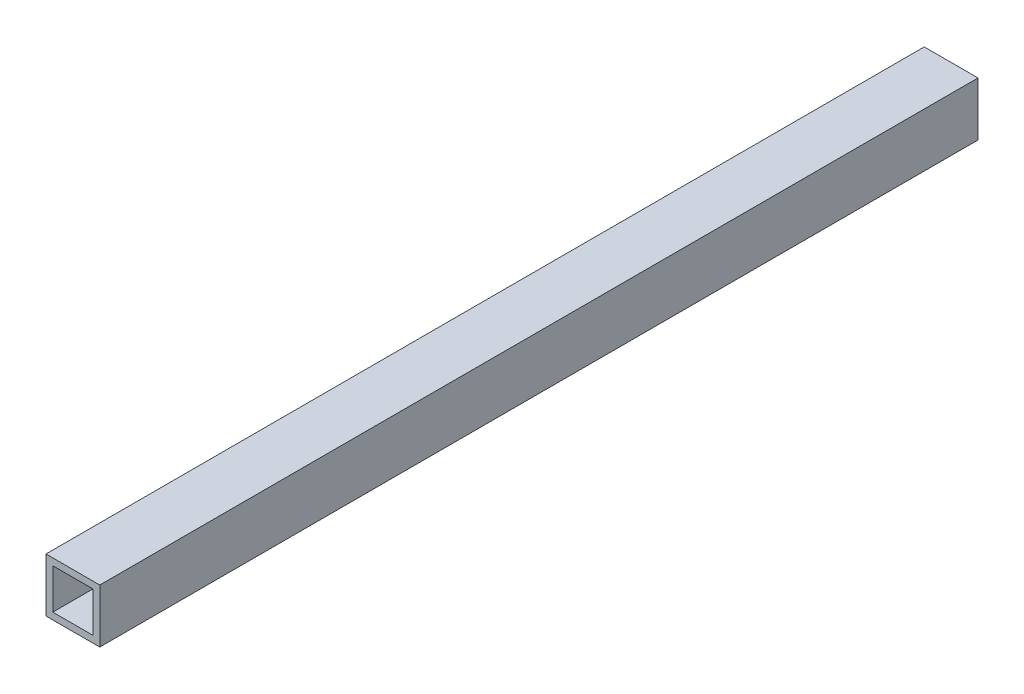
ISO-10303-21;
HEADER;
FILE_DESCRIPTION(('STEP AP214'),'2;1');
FILE_NAME('part.step','',(''),(''),'','','');
FILE_SCHEMA(('AUTOMOTIVE_DESIGN { 1 0 10303 214 1 1 1 1 }'));
ENDSEC;
DATA;
#1=APPLICATION_CONTEXT('core data for automotive mechanical design processes');
#2=APPLICATION_PROTOCOL_DEFINITION('international standard','automotive_design',2000,#1);
#3=PRODUCT_CONTEXT('',#1,'mechanical');
#4=PRODUCT('Part','Part','',(#3));
#5=PRODUCT_RELATED_PRODUCT_CATEGORY('part','',(#4));
#6=PRODUCT_DEFINITION_FORMATION('','',#4);
#7=PRODUCT_DEFINITION_CONTEXT('part definition',#1,'design');
#8=PRODUCT_DEFINITION('design','',#6,#7);
#9=PRODUCT_DEFINITION_SHAPE('','',#8);
#10=(LENGTH_UNIT() NAMED_UNIT(*) SI_UNIT(.MILLI.,.METRE.));
#11=(NAMED_UNIT(*) PLANE_ANGLE_UNIT() SI_UNIT($,.RADIAN.));
#12=(NAMED_UNIT(*) SI_UNIT($,.STERADIAN.) SOLID_ANGLE_UNIT());
#13=UNCERTAINTY_MEASURE_WITH_UNIT(LENGTH_MEASURE(1.E-05),#10,'distance_accuracy_value','');
#14=(GEOMETRIC_REPRESENTATION_CONTEXT(3) GLOBAL_UNCERTAINTY_ASSIGNED_CONTEXT((#13)) GLOBAL_UNIT_ASSIGNED_CONTEXT((#10,
#11,#12)) REPRESENTATION_CONTEXT('',''));
#15=CARTESIAN_POINT('',(0.,0.,0.));
#16=DIRECTION('',(0.,0.,1.));
#17=DIRECTION('',(1.,0.,0.));
#18=AXIS2_PLACEMENT_3D('',#15,#16,#17);
#19=CARTESIAN_POINT('',(0.,0.,99.));
#20=DIRECTION('',(0.,0.,1.));
#21=DIRECTION('',(1.,0.,0.));
#22=AXIS2_PLACEMENT_3D('',#19,#20,#21);
#23=PLANE('',#22);
#24=DIRECTION('',(0.,1.,0.));
#25=VECTOR('',#24,1.);
#26=CARTESIAN_POINT('',(6.06,6.06,99.));
#27=LINE('',#26,#25);
#28=CARTESIAN_POINT('',(6.06,-6.06,99.));
#29=VERTEX_POINT('',#28);
#30=CARTESIAN_POINT('',(6.06,6.06,99.));
#31=VERTEX_POINT('',#30);
#32=EDGE_CURVE('E134',#29,#31,#27,.T.);
#33=ORIENTED_EDGE('',*,*,#32,.T.);
#34=DIRECTION('',(-1.,0.,0.));
#35=VECTOR('',#34,1.);
#36=CARTESIAN_POINT('',(-6.06,6.06,99.));
#37=LINE('',#36,#35);
#38=CARTESIAN_POINT('',(-6.06,6.06,99.));
#39=VERTEX_POINT('',#38);
#40=EDGE_CURVE('E137',#31,#39,#37,.T.);
#41=ORIENTED_EDGE('',*,*,#40,.T.);
#42=DIRECTION('',(0.,-1.,0.));
#43=VECTOR('',#42,1.);
#44=CARTESIAN_POINT('',(-6.06,6.06,99.));
#45=LINE('',#44,#43);
#46=CARTESIAN_POINT('',(-6.06,-6.06,99.));
#47=VERTEX_POINT('',#46);
#48=EDGE_CURVE('E140',#39,#47,#45,.T.);
#49=ORIENTED_EDGE('',*,*,#48,.T.);
#50=DIRECTION('',(1.,0.,0.));
#51=VECTOR('',#50,1.);
#52=CARTESIAN_POINT('',(-6.06,-6.06,99.));
#53=LINE('',#52,#51);
#54=EDGE_CURVE('E142',#47,#29,#53,.T.);
#55=ORIENTED_EDGE('',*,*,#54,.T.);
#56=EDGE_LOOP('',(#33,#41,#49,#55));
#57=FACE_BOUND('',#56,.T.);
#58=DIRECTION('',(-1.,0.,0.));
#59=VECTOR('',#58,1.);
#60=CARTESIAN_POINT('',(-4.53,4.53,99.));
#61=LINE('',#60,#59);
#62=CARTESIAN_POINT('',(4.53,4.53,99.));
#63=VERTEX_POINT('',#62);
#64=CARTESIAN_POINT('',(-4.53,4.53,99.));
#65=VERTEX_POINT('',#64);
#66=EDGE_CURVE('E106',#63,#65,#61,.T.);
#67=ORIENTED_EDGE('',*,*,#66,.F.);
#68=DIRECTION('',(0.,1.,0.));
#69=VECTOR('',#68,1.);
#70=CARTESIAN_POINT('',(4.53,4.53,99.));
#71=LINE('',#70,#69);
#72=CARTESIAN_POINT('',(4.53,-4.53,99.));
#73=VERTEX_POINT('',#72);
#74=EDGE_CURVE('E98',#73,#63,#71,.T.);
#75=ORIENTED_EDGE('',*,*,#74,.F.);
#76=DIRECTION('',(1.,0.,0.));
#77=VECTOR('',#76,1.);
#78=CARTESIAN_POINT('',(-4.53,-4.53,99.));
#79=LINE('',#78,#77);
#80=CARTESIAN_POINT('',(-4.53,-4.53,99.));
#81=VERTEX_POINT('',#80);
#82=EDGE_CURVE('E120',#81,#73,#79,.T.);
#83=ORIENTED_EDGE('',*,*,#82,.F.);
#84=DIRECTION('',(0.,-1.,0.));
#85=VECTOR('',#84,1.);
#86=CARTESIAN_POINT('',(-4.53,4.53,99.));
#87=LINE('',#86,#85);
#88=EDGE_CURVE('E118',#65,#81,#87,.T.);
#89=ORIENTED_EDGE('',*,*,#88,.F.);
#90=EDGE_LOOP('',(#67,#75,#83,#89));
#91=FACE_BOUND('',#90,.T.);
#92=ADVANCED_FACE('F33',(#57,#91),#23,.T.);
#93=CARTESIAN_POINT('',(0.,0.,-99.));
#94=DIRECTION('',(0.,0.,1.));
#95=DIRECTION('',(1.,0.,0.));
#96=AXIS2_PLACEMENT_3D('',#93,#94,#95);
#97=PLANE('',#96);
#98=DIRECTION('',(0.,1.,0.));
#99=VECTOR('',#98,1.);
#100=CARTESIAN_POINT('',(6.06,6.06,-99.));
#101=LINE('',#100,#99);
#102=CARTESIAN_POINT('',(6.06,-6.06,-99.));
#103=VERTEX_POINT('',#102);
#104=CARTESIAN_POINT('',(6.06,6.06,-99.));
#105=VERTEX_POINT('',#104);
#106=EDGE_CURVE('E114',#103,#105,#101,.T.);
#107=ORIENTED_EDGE('',*,*,#106,.F.);
#108=DIRECTION('',(1.,0.,0.));
#109=VECTOR('',#108,1.);
#110=CARTESIAN_POINT('',(-6.06,-6.06,-99.));
#111=LINE('',#110,#109);
#112=CARTESIAN_POINT('',(-6.06,-6.06,-99.));
#113=VERTEX_POINT('',#112);
#114=EDGE_CURVE('E138',#113,#103,#111,.T.);
#115=ORIENTED_EDGE('',*,*,#114,.F.);
#116=DIRECTION('',(0.,-1.,0.));
#117=VECTOR('',#116,1.);
#118=CARTESIAN_POINT('',(-6.06,6.06,-99.));
#119=LINE('',#118,#117);
#120=CARTESIAN_POINT('',(-6.06,6.06,-99.));
#121=VERTEX_POINT('',#120);
#122=EDGE_CURVE('E149',#121,#113,#119,.T.);
#123=ORIENTED_EDGE('',*,*,#122,.F.);
#124=DIRECTION('',(-1.,0.,0.));
#125=VECTOR('',#124,1.);
#126=CARTESIAN_POINT('',(-6.06,6.06,-99.));
#127=LINE('',#126,#125);
#128=EDGE_CURVE('E147',#105,#121,#127,.T.);
#129=ORIENTED_EDGE('',*,*,#128,.F.);
#130=EDGE_LOOP('',(#107,#115,#123,#129));
#131=FACE_BOUND('',#130,.T.);
#132=DIRECTION('',(0.,1.,0.));
#133=VECTOR('',#132,1.);
#134=CARTESIAN_POINT('',(4.53,4.53,-99.));
#135=LINE('',#134,#133);
#136=CARTESIAN_POINT('',(4.53,-4.53,-99.));
#137=VERTEX_POINT('',#136);
#138=CARTESIAN_POINT('',(4.53,4.53,-99.));
#139=VERTEX_POINT('',#138);
#140=EDGE_CURVE('E56',#137,#139,#135,.T.);
#141=ORIENTED_EDGE('',*,*,#140,.T.);
#142=DIRECTION('',(-1.,0.,0.));
#143=VECTOR('',#142,1.);
#144=CARTESIAN_POINT('',(-4.53,4.53,-99.));
#145=LINE('',#144,#143);
#146=CARTESIAN_POINT('',(-4.53,4.53,-99.));
#147=VERTEX_POINT('',#146);
#148=EDGE_CURVE('E113',#139,#147,#145,.T.);
#149=ORIENTED_EDGE('',*,*,#148,.T.);
#150=DIRECTION('',(0.,-1.,0.));
#151=VECTOR('',#150,1.);
#152=CARTESIAN_POINT('',(-4.53,4.53,-99.));
#153=LINE('',#152,#151);
#154=CARTESIAN_POINT('',(-4.53,-4.53,-99.));
#155=VERTEX_POINT('',#154);
#156=EDGE_CURVE('E126',#147,#155,#153,.T.);
#157=ORIENTED_EDGE('',*,*,#156,.T.);
#158=DIRECTION('',(1.,0.,0.));
#159=VECTOR('',#158,1.);
#160=CARTESIAN_POINT('',(-4.53,-4.53,-99.));
#161=LINE('',#160,#159);
#162=EDGE_CURVE('E107',#155,#137,#161,.T.);
#163=ORIENTED_EDGE('',*,*,#162,.T.);
#164=EDGE_LOOP('',(#141,#149,#157,#163));
#165=FACE_BOUND('',#164,.T.);
#166=ADVANCED_FACE('F167',(#131,#165),#97,.F.);
#167=CARTESIAN_POINT('',(6.06,6.06,99.));
#168=DIRECTION('',(-1.,0.,0.));
#169=DIRECTION('',(0.,0.,1.));
#170=AXIS2_PLACEMENT_3D('',#167,#168,#169);
#171=PLANE('',#170);
#172=ORIENTED_EDGE('',*,*,#106,.T.);
#173=DIRECTION('',(0.,0.,-1.));
#174=VECTOR('',#173,1.);
#175=CARTESIAN_POINT('',(6.06,6.06,99.));
#176=LINE('',#175,#174);
#177=EDGE_CURVE('E11',#31,#105,#176,.T.);
#178=ORIENTED_EDGE('',*,*,#177,.F.);
#179=ORIENTED_EDGE('',*,*,#32,.F.);
#180=DIRECTION('',(0.,0.,-1.));
#181=VECTOR('',#180,1.);
#182=CARTESIAN_POINT('',(6.06,-6.06,99.));
#183=LINE('',#182,#181);
#184=EDGE_CURVE('E144',#29,#103,#183,.T.);
#185=ORIENTED_EDGE('',*,*,#184,.T.);
#186=EDGE_LOOP('',(#172,#178,#179,#185));
#187=FACE_BOUND('',#186,.T.);
#188=ADVANCED_FACE('F35',(#187),#171,.F.);
#189=CARTESIAN_POINT('',(-6.06,6.06,99.));
#190=DIRECTION('',(0.,-1.,0.));
#191=DIRECTION('',(0.,0.,-1.));
#192=AXIS2_PLACEMENT_3D('',#189,#190,#191);
#193=PLANE('',#192);
#194=ORIENTED_EDGE('',*,*,#128,.T.);
#195=DIRECTION('',(0.,0.,-1.));
#196=VECTOR('',#195,1.);
#197=CARTESIAN_POINT('',(-6.06,6.06,99.));
#198=LINE('',#197,#196);
#199=EDGE_CURVE('E41',#39,#121,#198,.T.);
#200=ORIENTED_EDGE('',*,*,#199,.F.);
#201=ORIENTED_EDGE('',*,*,#40,.F.);
#202=ORIENTED_EDGE('',*,*,#177,.T.);
#203=EDGE_LOOP('',(#194,#200,#201,#202));
#204=FACE_BOUND('',#203,.T.);
#205=ADVANCED_FACE('F177',(#204),#193,.F.);
#206=CARTESIAN_POINT('',(-6.06,6.06,99.));
#207=DIRECTION('',(1.,0.,0.));
#208=DIRECTION('',(0.,0.,-1.));
#209=AXIS2_PLACEMENT_3D('',#206,#207,#208);
#210=PLANE('',#209);
#211=ORIENTED_EDGE('',*,*,#122,.T.);
#212=DIRECTION('',(0.,0.,-1.));
#213=VECTOR('',#212,1.);
#214=CARTESIAN_POINT('',(-6.06,-6.06,99.));
#215=LINE('',#214,#213);
#216=EDGE_CURVE('E154',#47,#113,#215,.T.);
#217=ORIENTED_EDGE('',*,*,#216,.F.);
#218=ORIENTED_EDGE('',*,*,#48,.F.);
#219=ORIENTED_EDGE('',*,*,#199,.T.);
#220=EDGE_LOOP('',(#211,#217,#218,#219));
#221=FACE_BOUND('',#220,.T.);
#222=ADVANCED_FACE('F161',(#221),#210,.F.);
#223=CARTESIAN_POINT('',(-6.06,-6.06,99.));
#224=DIRECTION('',(0.,1.,0.));
#225=DIRECTION('',(0.,0.,1.));
#226=AXIS2_PLACEMENT_3D('',#223,#224,#225);
#227=PLANE('',#226);
#228=ORIENTED_EDGE('',*,*,#114,.T.);
#229=ORIENTED_EDGE('',*,*,#184,.F.);
#230=ORIENTED_EDGE('',*,*,#54,.F.);
#231=ORIENTED_EDGE('',*,*,#216,.T.);
#232=EDGE_LOOP('',(#228,#229,#230,#231));
#233=FACE_BOUND('',#232,.T.);
#234=ADVANCED_FACE('F171',(#233),#227,.F.);
#235=CARTESIAN_POINT('',(4.53,4.53,99.));
#236=DIRECTION('',(-1.,0.,0.));
#237=DIRECTION('',(0.,0.,1.));
#238=AXIS2_PLACEMENT_3D('',#235,#236,#237);
#239=PLANE('',#238);
#240=ORIENTED_EDGE('',*,*,#140,.F.);
#241=DIRECTION('',(0.,0.,-1.));
#242=VECTOR('',#241,1.);
#243=CARTESIAN_POINT('',(4.53,-4.53,99.));
#244=LINE('',#243,#242);
#245=EDGE_CURVE('E102',#73,#137,#244,.T.);
#246=ORIENTED_EDGE('',*,*,#245,.F.);
#247=ORIENTED_EDGE('',*,*,#74,.T.);
#248=DIRECTION('',(0.,0.,-1.));
#249=VECTOR('',#248,1.);
#250=CARTESIAN_POINT('',(4.53,4.53,99.));
#251=LINE('',#250,#249);
#252=EDGE_CURVE('E101',#63,#139,#251,.T.);
#253=ORIENTED_EDGE('',*,*,#252,.T.);
#254=EDGE_LOOP('',(#240,#246,#247,#253));
#255=FACE_BOUND('',#254,.T.);
#256=ADVANCED_FACE('F100',(#255),#239,.T.);
#257=CARTESIAN_POINT('',(-4.53,4.53,99.));
#258=DIRECTION('',(0.,-1.,0.));
#259=DIRECTION('',(0.,0.,-1.));
#260=AXIS2_PLACEMENT_3D('',#257,#258,#259);
#261=PLANE('',#260);
#262=ORIENTED_EDGE('',*,*,#148,.F.);
#263=ORIENTED_EDGE('',*,*,#252,.F.);
#264=ORIENTED_EDGE('',*,*,#66,.T.);
#265=DIRECTION('',(0.,0.,-1.));
#266=VECTOR('',#265,1.);
#267=CARTESIAN_POINT('',(-4.53,4.53,99.));
#268=LINE('',#267,#266);
#269=EDGE_CURVE('E115',#65,#147,#268,.T.);
#270=ORIENTED_EDGE('',*,*,#269,.T.);
#271=EDGE_LOOP('',(#262,#263,#264,#270));
#272=FACE_BOUND('',#271,.T.);
#273=ADVANCED_FACE('F110',(#272),#261,.T.);
#274=CARTESIAN_POINT('',(-4.53,4.53,99.));
#275=DIRECTION('',(1.,0.,0.));
#276=DIRECTION('',(0.,0.,-1.));
#277=AXIS2_PLACEMENT_3D('',#274,#275,#276);
#278=PLANE('',#277);
#279=ORIENTED_EDGE('',*,*,#156,.F.);
#280=ORIENTED_EDGE('',*,*,#269,.F.);
#281=ORIENTED_EDGE('',*,*,#88,.T.);
#282=DIRECTION('',(0.,0.,-1.));
#283=VECTOR('',#282,1.);
#284=CARTESIAN_POINT('',(-4.53,-4.53,99.));
#285=LINE('',#284,#283);
#286=EDGE_CURVE('E48',#81,#155,#285,.T.);
#287=ORIENTED_EDGE('',*,*,#286,.T.);
#288=EDGE_LOOP('',(#279,#280,#281,#287));
#289=FACE_BOUND('',#288,.T.);
#290=ADVANCED_FACE('F200',(#289),#278,.T.);
#291=CARTESIAN_POINT('',(-4.53,-4.53,99.));
#292=DIRECTION('',(0.,1.,0.));
#293=DIRECTION('',(0.,0.,1.));
#294=AXIS2_PLACEMENT_3D('',#291,#292,#293);
#295=PLANE('',#294);
#296=ORIENTED_EDGE('',*,*,#162,.F.);
#297=ORIENTED_EDGE('',*,*,#286,.F.);
#298=ORIENTED_EDGE('',*,*,#82,.T.);
#299=ORIENTED_EDGE('',*,*,#245,.T.);
#300=EDGE_LOOP('',(#296,#297,#298,#299));
#301=FACE_BOUND('',#300,.T.);
#302=ADVANCED_FACE('F204',(#301),#295,.T.);
#303=CLOSED_SHELL('',(#92,#166,#188,#205,#222,#234,#256,#273,#290,#302));
#304=MANIFOLD_SOLID_BREP('B2',#303);
#305=ADVANCED_BREP_SHAPE_REPRESENTATION('',(#18,#304),#14);
#306=SHAPE_DEFINITION_REPRESENTATION(#9,#305);
ENDSEC;
END-ISO-10303-21;
